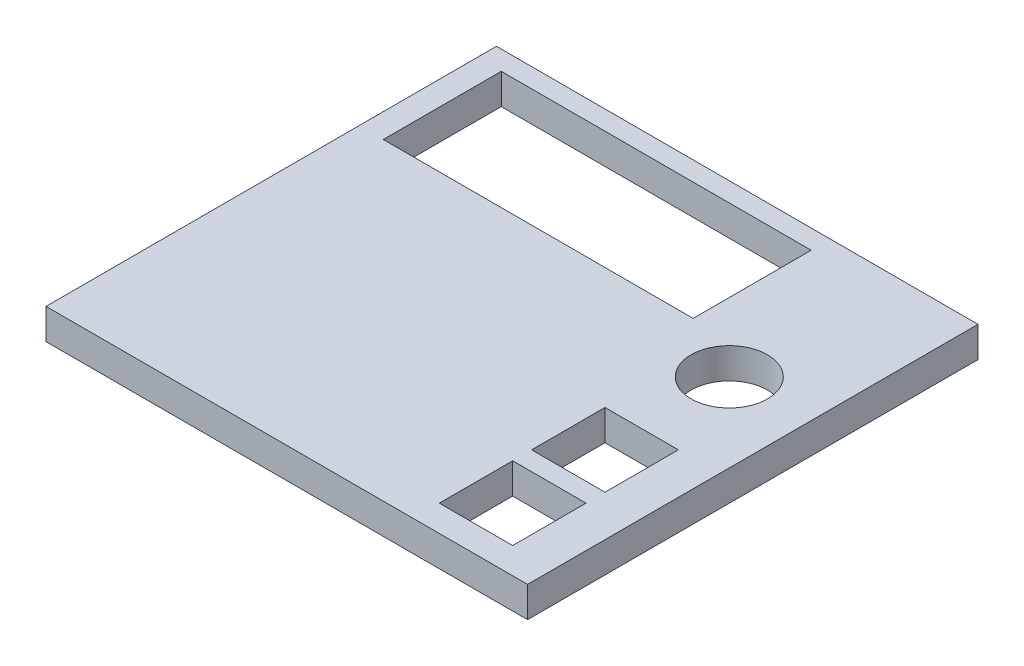
ISO-10303-21;
HEADER;
FILE_DESCRIPTION(('STEP AP214'),'2;1');
FILE_NAME('part.step','',(''),(''),'','','');
FILE_SCHEMA(('AUTOMOTIVE_DESIGN { 1 0 10303 214 1 1 1 1 }'));
ENDSEC;
DATA;
#1=APPLICATION_CONTEXT('core data for automotive mechanical design processes');
#2=APPLICATION_PROTOCOL_DEFINITION('international standard','automotive_design',2000,#1);
#3=PRODUCT_CONTEXT('',#1,'mechanical');
#4=PRODUCT('Part','Part','',(#3));
#5=PRODUCT_RELATED_PRODUCT_CATEGORY('part','',(#4));
#6=PRODUCT_DEFINITION_FORMATION('','',#4);
#7=PRODUCT_DEFINITION_CONTEXT('part definition',#1,'design');
#8=PRODUCT_DEFINITION('design','',#6,#7);
#9=PRODUCT_DEFINITION_SHAPE('','',#8);
#10=(LENGTH_UNIT() NAMED_UNIT(*) SI_UNIT(.MILLI.,.METRE.));
#11=(NAMED_UNIT(*) PLANE_ANGLE_UNIT() SI_UNIT($,.RADIAN.));
#12=(NAMED_UNIT(*) SI_UNIT($,.STERADIAN.) SOLID_ANGLE_UNIT());
#13=UNCERTAINTY_MEASURE_WITH_UNIT(LENGTH_MEASURE(1.E-05),#10,'distance_accuracy_value','');
#14=(GEOMETRIC_REPRESENTATION_CONTEXT(3) GLOBAL_UNCERTAINTY_ASSIGNED_CONTEXT((#13)) GLOBAL_UNIT_ASSIGNED_CONTEXT((#10,
#11,#12)) REPRESENTATION_CONTEXT('',''));
#15=CARTESIAN_POINT('',(0.,0.,0.));
#16=DIRECTION('',(0.,0.,1.));
#17=DIRECTION('',(1.,0.,0.));
#18=AXIS2_PLACEMENT_3D('',#15,#16,#17);
#19=CARTESIAN_POINT('',(0.,5.,0.));
#20=DIRECTION('',(0.,1.,0.));
#21=DIRECTION('',(0.,0.,1.));
#22=AXIS2_PLACEMENT_3D('',#19,#20,#21);
#23=PLANE('',#22);
#24=DIRECTION('',(1.,0.,0.));
#25=VECTOR('',#24,1.);
#26=CARTESIAN_POINT('',(-27.2231495530432,5.,12.911358183839));
#27=LINE('',#26,#25);
#28=CARTESIAN_POINT('',(-27.2231495530432,5.,12.911358183839));
#29=VERTEX_POINT('',#28);
#30=CARTESIAN_POINT('',(23.4468504469568,5.,12.911358183839));
#31=VERTEX_POINT('',#30);
#32=EDGE_CURVE('E255',#29,#31,#27,.T.);
#33=ORIENTED_EDGE('',*,*,#32,.F.);
#34=DIRECTION('',(0.,0.,1.));
#35=VECTOR('',#34,1.);
#36=CARTESIAN_POINT('',(-27.2231495530432,5.,-6.38864181616104));
#37=LINE('',#36,#35);
#38=CARTESIAN_POINT('',(-27.2231495530432,5.,-6.38864181616104));
#39=VERTEX_POINT('',#38);
#40=EDGE_CURVE('E252',#39,#29,#37,.T.);
#41=ORIENTED_EDGE('',*,*,#40,.F.);
#42=DIRECTION('',(-1.,0.,0.));
#43=VECTOR('',#42,1.);
#44=CARTESIAN_POINT('',(-27.2231495530432,5.,-6.38864181616104));
#45=LINE('',#44,#43);
#46=CARTESIAN_POINT('',(23.4468504469568,5.,-6.38864181616104));
#47=VERTEX_POINT('',#46);
#48=EDGE_CURVE('E263',#47,#39,#45,.T.);
#49=ORIENTED_EDGE('',*,*,#48,.F.);
#50=DIRECTION('',(0.,0.,-1.));
#51=VECTOR('',#50,1.);
#52=CARTESIAN_POINT('',(23.4468504469568,5.,-6.38864181616104));
#53=LINE('',#52,#51);
#54=EDGE_CURVE('E259',#31,#47,#53,.T.);
#55=ORIENTED_EDGE('',*,*,#54,.F.);
#56=EDGE_LOOP('',(#33,#41,#49,#55));
#57=FACE_BOUND('',#56,.T.);
#58=DIRECTION('',(0.,0.,1.));
#59=VECTOR('',#58,1.);
#60=CARTESIAN_POINT('',(-31.1631495530432,5.,-9.53864181616104));
#61=LINE('',#60,#59);
#62=CARTESIAN_POINT('',(-31.1631495530432,5.,-9.53864181616104));
#63=VERTEX_POINT('',#62);
#64=CARTESIAN_POINT('',(-31.1631495530432,5.,64.121358183839));
#65=VERTEX_POINT('',#64);
#66=EDGE_CURVE('E295',#63,#65,#61,.T.);
#67=ORIENTED_EDGE('',*,*,#66,.T.);
#68=DIRECTION('',(1.,0.,0.));
#69=VECTOR('',#68,1.);
#70=CARTESIAN_POINT('',(-31.1631495530432,5.,64.121358183839));
#71=LINE('',#70,#69);
#72=CARTESIAN_POINT('',(47.5768504469568,5.,64.121358183839));
#73=VERTEX_POINT('',#72);
#74=EDGE_CURVE('E299',#65,#73,#71,.T.);
#75=ORIENTED_EDGE('',*,*,#74,.T.);
#76=DIRECTION('',(0.,0.,-1.));
#77=VECTOR('',#76,1.);
#78=CARTESIAN_POINT('',(47.5768504469568,5.,-9.53864181616104));
#79=LINE('',#78,#77);
#80=CARTESIAN_POINT('',(47.5768504469568,5.,-9.53864181616104));
#81=VERTEX_POINT('',#80);
#82=EDGE_CURVE('E303',#73,#81,#79,.T.);
#83=ORIENTED_EDGE('',*,*,#82,.T.);
#84=DIRECTION('',(-1.,0.,0.));
#85=VECTOR('',#84,1.);
#86=CARTESIAN_POINT('',(-31.1631495530432,5.,-9.53864181616104));
#87=LINE('',#86,#85);
#88=EDGE_CURVE('E306',#81,#63,#87,.T.);
#89=ORIENTED_EDGE('',*,*,#88,.T.);
#90=EDGE_LOOP('',(#67,#75,#83,#89));
#91=FACE_BOUND('',#90,.T.);
#92=CARTESIAN_POINT('',(34.6768504469568,5.,18.233358183839));
#93=DIRECTION('',(0.,1.,0.));
#94=DIRECTION('',(0.,0.,1.));
#95=AXIS2_PLACEMENT_3D('',#92,#93,#94);
#96=CIRCLE('',#95,6.25000000000001);
#97=CARTESIAN_POINT('',(34.6768504469568,5.,24.483358183839));
#98=VERTEX_POINT('',#97);
#99=EDGE_CURVE('E244',#98,#98,#96,.T.);
#100=ORIENTED_EDGE('',*,*,#99,.F.);
#101=EDGE_LOOP('',(#100));
#102=FACE_BOUND('',#101,.T.);
#103=DIRECTION('',(1.,0.,0.));
#104=VECTOR('',#103,1.);
#105=CARTESIAN_POINT('',(28.8578504469568,5.,44.733358183839));
#106=LINE('',#105,#104);
#107=CARTESIAN_POINT('',(28.8578504469568,5.,44.733358183839));
#108=VERTEX_POINT('',#107);
#109=CARTESIAN_POINT('',(40.8578504469568,5.,44.733358183839));
#110=VERTEX_POINT('',#109);
#111=EDGE_CURVE('E204',#108,#110,#106,.T.);
#112=ORIENTED_EDGE('',*,*,#111,.F.);
#113=DIRECTION('',(0.,0.,1.));
#114=VECTOR('',#113,1.);
#115=CARTESIAN_POINT('',(28.8578504469568,5.,32.733358183839));
#116=LINE('',#115,#114);
#117=CARTESIAN_POINT('',(28.8578504469568,5.,32.733358183839));
#118=VERTEX_POINT('',#117);
#119=EDGE_CURVE('E201',#118,#108,#116,.T.);
#120=ORIENTED_EDGE('',*,*,#119,.F.);
#121=DIRECTION('',(-1.,0.,0.));
#122=VECTOR('',#121,1.);
#123=CARTESIAN_POINT('',(28.8578504469568,5.,32.733358183839));
#124=LINE('',#123,#122);
#125=CARTESIAN_POINT('',(40.8578504469568,5.,32.733358183839));
#126=VERTEX_POINT('',#125);
#127=EDGE_CURVE('E212',#126,#118,#124,.T.);
#128=ORIENTED_EDGE('',*,*,#127,.F.);
#129=DIRECTION('',(0.,0.,-1.));
#130=VECTOR('',#129,1.);
#131=CARTESIAN_POINT('',(40.8578504469568,5.,32.733358183839));
#132=LINE('',#131,#130);
#133=EDGE_CURVE('E208',#110,#126,#132,.T.);
#134=ORIENTED_EDGE('',*,*,#133,.F.);
#135=EDGE_LOOP('',(#112,#120,#128,#134));
#136=FACE_BOUND('',#135,.T.);
#137=DIRECTION('',(1.,0.,0.));
#138=VECTOR('',#137,1.);
#139=CARTESIAN_POINT('',(28.8578504469568,5.,59.833358183839));
#140=LINE('',#139,#138);
#141=CARTESIAN_POINT('',(28.8578504469568,5.,59.833358183839));
#142=VERTEX_POINT('',#141);
#143=CARTESIAN_POINT('',(40.8578504469568,5.,59.833358183839));
#144=VERTEX_POINT('',#143);
#145=EDGE_CURVE('E162',#142,#144,#140,.T.);
#146=ORIENTED_EDGE('',*,*,#145,.F.);
#147=DIRECTION('',(0.,0.,1.));
#148=VECTOR('',#147,1.);
#149=CARTESIAN_POINT('',(28.8578504469568,5.,47.833358183839));
#150=LINE('',#149,#148);
#151=CARTESIAN_POINT('',(28.8578504469568,5.,47.833358183839));
#152=VERTEX_POINT('',#151);
#153=EDGE_CURVE('E153',#152,#142,#150,.T.);
#154=ORIENTED_EDGE('',*,*,#153,.F.);
#155=DIRECTION('',(-1.,0.,0.));
#156=VECTOR('',#155,1.);
#157=CARTESIAN_POINT('',(28.8578504469568,5.,47.833358183839));
#158=LINE('',#157,#156);
#159=CARTESIAN_POINT('',(40.8578504469568,5.,47.833358183839));
#160=VERTEX_POINT('',#159);
#161=EDGE_CURVE('E179',#160,#152,#158,.T.);
#162=ORIENTED_EDGE('',*,*,#161,.F.);
#163=DIRECTION('',(0.,0.,-1.));
#164=VECTOR('',#163,1.);
#165=CARTESIAN_POINT('',(40.8578504469568,5.,47.833358183839));
#166=LINE('',#165,#164);
#167=EDGE_CURVE('E175',#144,#160,#166,.T.);
#168=ORIENTED_EDGE('',*,*,#167,.F.);
#169=EDGE_LOOP('',(#146,#154,#162,#168));
#170=FACE_BOUND('',#169,.T.);
#171=ADVANCED_FACE('F39',(#57,#91,#102,#136,#170),#23,.T.);
#172=CARTESIAN_POINT('',(0.,0.,0.));
#173=DIRECTION('',(0.,1.,0.));
#174=DIRECTION('',(0.,0.,1.));
#175=AXIS2_PLACEMENT_3D('',#172,#173,#174);
#176=PLANE('',#175);
#177=DIRECTION('',(0.,0.,1.));
#178=VECTOR('',#177,1.);
#179=CARTESIAN_POINT('',(28.8578504469568,0.,32.733358183839));
#180=LINE('',#179,#178);
#181=CARTESIAN_POINT('',(28.8578504469568,0.,32.733358183839));
#182=VERTEX_POINT('',#181);
#183=CARTESIAN_POINT('',(28.8578504469568,0.,44.733358183839));
#184=VERTEX_POINT('',#183);
#185=EDGE_CURVE('E171',#182,#184,#180,.T.);
#186=ORIENTED_EDGE('',*,*,#185,.T.);
#187=DIRECTION('',(1.,0.,0.));
#188=VECTOR('',#187,1.);
#189=CARTESIAN_POINT('',(28.8578504469568,0.,44.733358183839));
#190=LINE('',#189,#188);
#191=CARTESIAN_POINT('',(40.8578504469568,0.,44.733358183839));
#192=VERTEX_POINT('',#191);
#193=EDGE_CURVE('E219',#184,#192,#190,.T.);
#194=ORIENTED_EDGE('',*,*,#193,.T.);
#195=DIRECTION('',(0.,0.,-1.));
#196=VECTOR('',#195,1.);
#197=CARTESIAN_POINT('',(40.8578504469568,0.,32.733358183839));
#198=LINE('',#197,#196);
#199=CARTESIAN_POINT('',(40.8578504469568,0.,32.733358183839));
#200=VERTEX_POINT('',#199);
#201=EDGE_CURVE('E223',#192,#200,#198,.T.);
#202=ORIENTED_EDGE('',*,*,#201,.T.);
#203=DIRECTION('',(-1.,0.,0.));
#204=VECTOR('',#203,1.);
#205=CARTESIAN_POINT('',(28.8578504469568,0.,32.733358183839));
#206=LINE('',#205,#204);
#207=EDGE_CURVE('E205',#200,#182,#206,.T.);
#208=ORIENTED_EDGE('',*,*,#207,.T.);
#209=EDGE_LOOP('',(#186,#194,#202,#208));
#210=FACE_BOUND('',#209,.T.);
#211=DIRECTION('',(0.,0.,1.));
#212=VECTOR('',#211,1.);
#213=CARTESIAN_POINT('',(-31.1631495530432,0.,-9.53864181616104));
#214=LINE('',#213,#212);
#215=CARTESIAN_POINT('',(-31.1631495530432,0.,-9.53864181616104));
#216=VERTEX_POINT('',#215);
#217=CARTESIAN_POINT('',(-31.1631495530432,0.,64.121358183839));
#218=VERTEX_POINT('',#217);
#219=EDGE_CURVE('E294',#216,#218,#214,.T.);
#220=ORIENTED_EDGE('',*,*,#219,.F.);
#221=DIRECTION('',(-1.,0.,0.));
#222=VECTOR('',#221,1.);
#223=CARTESIAN_POINT('',(-31.1631495530432,0.,-9.53864181616104));
#224=LINE('',#223,#222);
#225=CARTESIAN_POINT('',(47.5768504469568,0.,-9.53864181616104));
#226=VERTEX_POINT('',#225);
#227=EDGE_CURVE('E300',#226,#216,#224,.T.);
#228=ORIENTED_EDGE('',*,*,#227,.F.);
#229=DIRECTION('',(0.,0.,-1.));
#230=VECTOR('',#229,1.);
#231=CARTESIAN_POINT('',(47.5768504469568,0.,-9.53864181616104));
#232=LINE('',#231,#230);
#233=CARTESIAN_POINT('',(47.5768504469568,0.,64.121358183839));
#234=VERTEX_POINT('',#233);
#235=EDGE_CURVE('E316',#234,#226,#232,.T.);
#236=ORIENTED_EDGE('',*,*,#235,.F.);
#237=DIRECTION('',(1.,0.,0.));
#238=VECTOR('',#237,1.);
#239=CARTESIAN_POINT('',(-31.1631495530432,0.,64.121358183839));
#240=LINE('',#239,#238);
#241=EDGE_CURVE('E313',#218,#234,#240,.T.);
#242=ORIENTED_EDGE('',*,*,#241,.F.);
#243=EDGE_LOOP('',(#220,#228,#236,#242));
#244=FACE_BOUND('',#243,.T.);
#245=DIRECTION('',(0.,0.,1.));
#246=VECTOR('',#245,1.);
#247=CARTESIAN_POINT('',(-27.2231495530432,0.,-6.38864181616104));
#248=LINE('',#247,#246);
#249=CARTESIAN_POINT('',(-27.2231495530432,0.,-6.38864181616104));
#250=VERTEX_POINT('',#249);
#251=CARTESIAN_POINT('',(-27.2231495530432,0.,12.911358183839));
#252=VERTEX_POINT('',#251);
#253=EDGE_CURVE('E248',#250,#252,#248,.T.);
#254=ORIENTED_EDGE('',*,*,#253,.T.);
#255=DIRECTION('',(1.,0.,0.));
#256=VECTOR('',#255,1.);
#257=CARTESIAN_POINT('',(-27.2231495530432,0.,12.911358183839));
#258=LINE('',#257,#256);
#259=CARTESIAN_POINT('',(23.4468504469568,0.,12.911358183839));
#260=VERTEX_POINT('',#259);
#261=EDGE_CURVE('E270',#252,#260,#258,.T.);
#262=ORIENTED_EDGE('',*,*,#261,.T.);
#263=DIRECTION('',(0.,0.,-1.));
#264=VECTOR('',#263,1.);
#265=CARTESIAN_POINT('',(23.4468504469568,0.,-6.38864181616104));
#266=LINE('',#265,#264);
#267=CARTESIAN_POINT('',(23.4468504469568,0.,-6.38864181616104));
#268=VERTEX_POINT('',#267);
#269=EDGE_CURVE('E274',#260,#268,#266,.T.);
#270=ORIENTED_EDGE('',*,*,#269,.T.);
#271=DIRECTION('',(-1.,0.,0.));
#272=VECTOR('',#271,1.);
#273=CARTESIAN_POINT('',(-27.2231495530432,0.,-6.38864181616104));
#274=LINE('',#273,#272);
#275=EDGE_CURVE('E256',#268,#250,#274,.T.);
#276=ORIENTED_EDGE('',*,*,#275,.T.);
#277=EDGE_LOOP('',(#254,#262,#270,#276));
#278=FACE_BOUND('',#277,.T.);
#279=CARTESIAN_POINT('',(34.6768504469568,0.,18.233358183839));
#280=DIRECTION('',(0.,1.,0.));
#281=DIRECTION('',(0.,0.,1.));
#282=AXIS2_PLACEMENT_3D('',#279,#280,#281);
#283=CIRCLE('',#282,6.25000000000001);
#284=CARTESIAN_POINT('',(34.6768504469568,0.,24.483358183839));
#285=VERTEX_POINT('',#284);
#286=EDGE_CURVE('E243',#285,#285,#283,.T.);
#287=ORIENTED_EDGE('',*,*,#286,.T.);
#288=EDGE_LOOP('',(#287));
#289=FACE_BOUND('',#288,.T.);
#290=DIRECTION('',(0.,0.,1.));
#291=VECTOR('',#290,1.);
#292=CARTESIAN_POINT('',(28.8578504469568,0.,47.833358183839));
#293=LINE('',#292,#291);
#294=CARTESIAN_POINT('',(28.8578504469568,0.,47.833358183839));
#295=VERTEX_POINT('',#294);
#296=CARTESIAN_POINT('',(28.8578504469568,0.,59.833358183839));
#297=VERTEX_POINT('',#296);
#298=EDGE_CURVE('E63',#295,#297,#293,.T.);
#299=ORIENTED_EDGE('',*,*,#298,.T.);
#300=DIRECTION('',(1.,0.,0.));
#301=VECTOR('',#300,1.);
#302=CARTESIAN_POINT('',(28.8578504469568,0.,59.833358183839));
#303=LINE('',#302,#301);
#304=CARTESIAN_POINT('',(40.8578504469568,0.,59.833358183839));
#305=VERTEX_POINT('',#304);
#306=EDGE_CURVE('E169',#297,#305,#303,.T.);
#307=ORIENTED_EDGE('',*,*,#306,.T.);
#308=DIRECTION('',(0.,0.,-1.));
#309=VECTOR('',#308,1.);
#310=CARTESIAN_POINT('',(40.8578504469568,0.,47.833358183839));
#311=LINE('',#310,#309);
#312=CARTESIAN_POINT('',(40.8578504469568,0.,47.833358183839));
#313=VERTEX_POINT('',#312);
#314=EDGE_CURVE('E188',#305,#313,#311,.T.);
#315=ORIENTED_EDGE('',*,*,#314,.T.);
#316=DIRECTION('',(-1.,0.,0.));
#317=VECTOR('',#316,1.);
#318=CARTESIAN_POINT('',(28.8578504469568,0.,47.833358183839));
#319=LINE('',#318,#317);
#320=EDGE_CURVE('E163',#313,#295,#319,.T.);
#321=ORIENTED_EDGE('',*,*,#320,.T.);
#322=EDGE_LOOP('',(#299,#307,#315,#321));
#323=FACE_BOUND('',#322,.T.);
#324=ADVANCED_FACE('F339',(#210,#244,#278,#289,#323),#176,.F.);
#325=CARTESIAN_POINT('',(-31.1631495530432,5.,-9.53864181616104));
#326=DIRECTION('',(1.,0.,0.));
#327=DIRECTION('',(0.,0.,-1.));
#328=AXIS2_PLACEMENT_3D('',#325,#326,#327);
#329=PLANE('',#328);
#330=ORIENTED_EDGE('',*,*,#219,.T.);
#331=DIRECTION('',(0.,-1.,0.));
#332=VECTOR('',#331,1.);
#333=CARTESIAN_POINT('',(-31.1631495530432,5.,64.121358183839));
#334=LINE('',#333,#332);
#335=EDGE_CURVE('E11',#65,#218,#334,.T.);
#336=ORIENTED_EDGE('',*,*,#335,.F.);
#337=ORIENTED_EDGE('',*,*,#66,.F.);
#338=DIRECTION('',(0.,-1.,0.));
#339=VECTOR('',#338,1.);
#340=CARTESIAN_POINT('',(-31.1631495530432,5.,-9.53864181616104));
#341=LINE('',#340,#339);
#342=EDGE_CURVE('E309',#63,#216,#341,.T.);
#343=ORIENTED_EDGE('',*,*,#342,.T.);
#344=EDGE_LOOP('',(#330,#336,#337,#343));
#345=FACE_BOUND('',#344,.T.);
#346=ADVANCED_FACE('F41',(#345),#329,.F.);
#347=CARTESIAN_POINT('',(-31.1631495530432,5.,64.121358183839));
#348=DIRECTION('',(0.,0.,-1.));
#349=DIRECTION('',(-1.,0.,0.));
#350=AXIS2_PLACEMENT_3D('',#347,#348,#349);
#351=PLANE('',#350);
#352=ORIENTED_EDGE('',*,*,#241,.T.);
#353=DIRECTION('',(0.,-1.,0.));
#354=VECTOR('',#353,1.);
#355=CARTESIAN_POINT('',(47.5768504469568,5.,64.121358183839));
#356=LINE('',#355,#354);
#357=EDGE_CURVE('E48',#73,#234,#356,.T.);
#358=ORIENTED_EDGE('',*,*,#357,.F.);
#359=ORIENTED_EDGE('',*,*,#74,.F.);
#360=ORIENTED_EDGE('',*,*,#335,.T.);
#361=EDGE_LOOP('',(#352,#358,#359,#360));
#362=FACE_BOUND('',#361,.T.);
#363=ADVANCED_FACE('F350',(#362),#351,.F.);
#364=CARTESIAN_POINT('',(47.5768504469568,5.,-9.53864181616104));
#365=DIRECTION('',(-1.,0.,0.));
#366=DIRECTION('',(0.,0.,1.));
#367=AXIS2_PLACEMENT_3D('',#364,#365,#366);
#368=PLANE('',#367);
#369=ORIENTED_EDGE('',*,*,#235,.T.);
#370=DIRECTION('',(0.,-1.,0.));
#371=VECTOR('',#370,1.);
#372=CARTESIAN_POINT('',(47.5768504469568,5.,-9.53864181616104));
#373=LINE('',#372,#371);
#374=EDGE_CURVE('E324',#81,#226,#373,.T.);
#375=ORIENTED_EDGE('',*,*,#374,.F.);
#376=ORIENTED_EDGE('',*,*,#82,.F.);
#377=ORIENTED_EDGE('',*,*,#357,.T.);
#378=EDGE_LOOP('',(#369,#375,#376,#377));
#379=FACE_BOUND('',#378,.T.);
#380=ADVANCED_FACE('F333',(#379),#368,.F.);
#381=CARTESIAN_POINT('',(-31.1631495530432,5.,-9.53864181616104));
#382=DIRECTION('',(0.,0.,1.));
#383=DIRECTION('',(1.,0.,0.));
#384=AXIS2_PLACEMENT_3D('',#381,#382,#383);
#385=PLANE('',#384);
#386=ORIENTED_EDGE('',*,*,#227,.T.);
#387=ORIENTED_EDGE('',*,*,#342,.F.);
#388=ORIENTED_EDGE('',*,*,#88,.F.);
#389=ORIENTED_EDGE('',*,*,#374,.T.);
#390=EDGE_LOOP('',(#386,#387,#388,#389));
#391=FACE_BOUND('',#390,.T.);
#392=ADVANCED_FACE('F343',(#391),#385,.F.);
#393=CARTESIAN_POINT('',(-27.2231495530432,5.,-6.38864181616104));
#394=DIRECTION('',(1.,0.,0.));
#395=DIRECTION('',(0.,0.,-1.));
#396=AXIS2_PLACEMENT_3D('',#393,#394,#395);
#397=PLANE('',#396);
#398=ORIENTED_EDGE('',*,*,#253,.F.);
#399=DIRECTION('',(0.,-1.,0.));
#400=VECTOR('',#399,1.);
#401=CARTESIAN_POINT('',(-27.2231495530432,5.,-6.38864181616104));
#402=LINE('',#401,#400);
#403=EDGE_CURVE('E266',#39,#250,#402,.T.);
#404=ORIENTED_EDGE('',*,*,#403,.F.);
#405=ORIENTED_EDGE('',*,*,#40,.T.);
#406=DIRECTION('',(0.,-1.,0.));
#407=VECTOR('',#406,1.);
#408=CARTESIAN_POINT('',(-27.2231495530432,5.,12.911358183839));
#409=LINE('',#408,#407);
#410=EDGE_CURVE('E290',#29,#252,#409,.T.);
#411=ORIENTED_EDGE('',*,*,#410,.T.);
#412=EDGE_LOOP('',(#398,#404,#405,#411));
#413=FACE_BOUND('',#412,.T.);
#414=ADVANCED_FACE('F367',(#413),#397,.T.);
#415=CARTESIAN_POINT('',(-27.2231495530432,5.,12.911358183839));
#416=DIRECTION('',(0.,0.,-1.));
#417=DIRECTION('',(-1.,0.,0.));
#418=AXIS2_PLACEMENT_3D('',#415,#416,#417);
#419=PLANE('',#418);
#420=ORIENTED_EDGE('',*,*,#261,.F.);
#421=ORIENTED_EDGE('',*,*,#410,.F.);
#422=ORIENTED_EDGE('',*,*,#32,.T.);
#423=DIRECTION('',(0.,-1.,0.));
#424=VECTOR('',#423,1.);
#425=CARTESIAN_POINT('',(23.4468504469568,5.,12.911358183839));
#426=LINE('',#425,#424);
#427=EDGE_CURVE('E287',#31,#260,#426,.T.);
#428=ORIENTED_EDGE('',*,*,#427,.T.);
#429=EDGE_LOOP('',(#420,#421,#422,#428));
#430=FACE_BOUND('',#429,.T.);
#431=ADVANCED_FACE('F374',(#430),#419,.T.);
#432=CARTESIAN_POINT('',(23.4468504469568,5.,-6.38864181616104));
#433=DIRECTION('',(-1.,0.,0.));
#434=DIRECTION('',(0.,0.,1.));
#435=AXIS2_PLACEMENT_3D('',#432,#433,#434);
#436=PLANE('',#435);
#437=ORIENTED_EDGE('',*,*,#269,.F.);
#438=ORIENTED_EDGE('',*,*,#427,.F.);
#439=ORIENTED_EDGE('',*,*,#54,.T.);
#440=DIRECTION('',(0.,-1.,0.));
#441=VECTOR('',#440,1.);
#442=CARTESIAN_POINT('',(23.4468504469568,5.,-6.38864181616104));
#443=LINE('',#442,#441);
#444=EDGE_CURVE('E284',#47,#268,#443,.T.);
#445=ORIENTED_EDGE('',*,*,#444,.T.);
#446=EDGE_LOOP('',(#437,#438,#439,#445));
#447=FACE_BOUND('',#446,.T.);
#448=ADVANCED_FACE('F379',(#447),#436,.T.);
#449=CARTESIAN_POINT('',(-27.2231495530432,5.,-6.38864181616104));
#450=DIRECTION('',(0.,0.,1.));
#451=DIRECTION('',(1.,0.,0.));
#452=AXIS2_PLACEMENT_3D('',#449,#450,#451);
#453=PLANE('',#452);
#454=ORIENTED_EDGE('',*,*,#275,.F.);
#455=ORIENTED_EDGE('',*,*,#444,.F.);
#456=ORIENTED_EDGE('',*,*,#48,.T.);
#457=ORIENTED_EDGE('',*,*,#403,.T.);
#458=EDGE_LOOP('',(#454,#455,#456,#457));
#459=FACE_BOUND('',#458,.T.);
#460=ADVANCED_FACE('F386',(#459),#453,.T.);
#461=CARTESIAN_POINT('',(34.6768504469568,5.,18.233358183839));
#462=DIRECTION('',(0.,-1.,0.));
#463=DIRECTION('',(0.,0.,-1.));
#464=AXIS2_PLACEMENT_3D('',#461,#462,#463);
#465=CYLINDRICAL_SURFACE('',#464,6.25000000000001);
#466=ORIENTED_EDGE('',*,*,#99,.T.);
#467=EDGE_LOOP('',(#466));
#468=FACE_BOUND('',#467,.T.);
#469=ORIENTED_EDGE('',*,*,#286,.F.);
#470=EDGE_LOOP('',(#469));
#471=FACE_BOUND('',#470,.T.);
#472=ADVANCED_FACE('F398',(#468,#471),#465,.F.);
#473=CARTESIAN_POINT('',(28.8578504469568,5.,32.733358183839));
#474=DIRECTION('',(1.,0.,0.));
#475=DIRECTION('',(0.,0.,-1.));
#476=AXIS2_PLACEMENT_3D('',#473,#474,#475);
#477=PLANE('',#476);
#478=ORIENTED_EDGE('',*,*,#185,.F.);
#479=DIRECTION('',(0.,-1.,0.));
#480=VECTOR('',#479,1.);
#481=CARTESIAN_POINT('',(28.8578504469568,5.,32.733358183839));
#482=LINE('',#481,#480);
#483=EDGE_CURVE('E215',#118,#182,#482,.T.);
#484=ORIENTED_EDGE('',*,*,#483,.F.);
#485=ORIENTED_EDGE('',*,*,#119,.T.);
#486=DIRECTION('',(0.,-1.,0.));
#487=VECTOR('',#486,1.);
#488=CARTESIAN_POINT('',(28.8578504469568,5.,44.733358183839));
#489=LINE('',#488,#487);
#490=EDGE_CURVE('E239',#108,#184,#489,.T.);
#491=ORIENTED_EDGE('',*,*,#490,.T.);
#492=EDGE_LOOP('',(#478,#484,#485,#491));
#493=FACE_BOUND('',#492,.T.);
#494=ADVANCED_FACE('F403',(#493),#477,.T.);
#495=CARTESIAN_POINT('',(28.8578504469568,5.,44.733358183839));
#496=DIRECTION('',(0.,0.,-1.));
#497=DIRECTION('',(-1.,0.,0.));
#498=AXIS2_PLACEMENT_3D('',#495,#496,#497);
#499=PLANE('',#498);
#500=ORIENTED_EDGE('',*,*,#193,.F.);
#501=ORIENTED_EDGE('',*,*,#490,.F.);
#502=ORIENTED_EDGE('',*,*,#111,.T.);
#503=DIRECTION('',(0.,-1.,0.));
#504=VECTOR('',#503,1.);
#505=CARTESIAN_POINT('',(40.8578504469568,5.,44.733358183839));
#506=LINE('',#505,#504);
#507=EDGE_CURVE('E236',#110,#192,#506,.T.);
#508=ORIENTED_EDGE('',*,*,#507,.T.);
#509=EDGE_LOOP('',(#500,#501,#502,#508));
#510=FACE_BOUND('',#509,.T.);
#511=ADVANCED_FACE('F407',(#510),#499,.T.);
#512=CARTESIAN_POINT('',(40.8578504469568,5.,32.733358183839));
#513=DIRECTION('',(-1.,0.,0.));
#514=DIRECTION('',(0.,0.,1.));
#515=AXIS2_PLACEMENT_3D('',#512,#513,#514);
#516=PLANE('',#515);
#517=ORIENTED_EDGE('',*,*,#201,.F.);
#518=ORIENTED_EDGE('',*,*,#507,.F.);
#519=ORIENTED_EDGE('',*,*,#133,.T.);
#520=DIRECTION('',(0.,-1.,0.));
#521=VECTOR('',#520,1.);
#522=CARTESIAN_POINT('',(40.8578504469568,5.,32.733358183839));
#523=LINE('',#522,#521);
#524=EDGE_CURVE('E233',#126,#200,#523,.T.);
#525=ORIENTED_EDGE('',*,*,#524,.T.);
#526=EDGE_LOOP('',(#517,#518,#519,#525));
#527=FACE_BOUND('',#526,.T.);
#528=ADVANCED_FACE('F411',(#527),#516,.T.);
#529=CARTESIAN_POINT('',(28.8578504469568,5.,32.733358183839));
#530=DIRECTION('',(0.,0.,1.));
#531=DIRECTION('',(1.,0.,0.));
#532=AXIS2_PLACEMENT_3D('',#529,#530,#531);
#533=PLANE('',#532);
#534=ORIENTED_EDGE('',*,*,#207,.F.);
#535=ORIENTED_EDGE('',*,*,#524,.F.);
#536=ORIENTED_EDGE('',*,*,#127,.T.);
#537=ORIENTED_EDGE('',*,*,#483,.T.);
#538=EDGE_LOOP('',(#534,#535,#536,#537));
#539=FACE_BOUND('',#538,.T.);
#540=ADVANCED_FACE('F415',(#539),#533,.T.);
#541=CARTESIAN_POINT('',(28.8578504469568,5.,47.833358183839));
#542=DIRECTION('',(1.,0.,0.));
#543=DIRECTION('',(0.,0.,-1.));
#544=AXIS2_PLACEMENT_3D('',#541,#542,#543);
#545=PLANE('',#544);
#546=ORIENTED_EDGE('',*,*,#298,.F.);
#547=DIRECTION('',(0.,-1.,0.));
#548=VECTOR('',#547,1.);
#549=CARTESIAN_POINT('',(28.8578504469568,5.,47.833358183839));
#550=LINE('',#549,#548);
#551=EDGE_CURVE('E157',#152,#295,#550,.T.);
#552=ORIENTED_EDGE('',*,*,#551,.F.);
#553=ORIENTED_EDGE('',*,*,#153,.T.);
#554=DIRECTION('',(0.,-1.,0.));
#555=VECTOR('',#554,1.);
#556=CARTESIAN_POINT('',(28.8578504469568,5.,59.833358183839));
#557=LINE('',#556,#555);
#558=EDGE_CURVE('E156',#142,#297,#557,.T.);
#559=ORIENTED_EDGE('',*,*,#558,.T.);
#560=EDGE_LOOP('',(#546,#552,#553,#559));
#561=FACE_BOUND('',#560,.T.);
#562=ADVANCED_FACE('F155',(#561),#545,.T.);
#563=CARTESIAN_POINT('',(28.8578504469568,5.,59.833358183839));
#564=DIRECTION('',(0.,0.,-1.));
#565=DIRECTION('',(-1.,0.,0.));
#566=AXIS2_PLACEMENT_3D('',#563,#564,#565);
#567=PLANE('',#566);
#568=ORIENTED_EDGE('',*,*,#306,.F.);
#569=ORIENTED_EDGE('',*,*,#558,.F.);
#570=ORIENTED_EDGE('',*,*,#145,.T.);
#571=DIRECTION('',(0.,-1.,0.));
#572=VECTOR('',#571,1.);
#573=CARTESIAN_POINT('',(40.8578504469568,5.,59.833358183839));
#574=LINE('',#573,#572);
#575=EDGE_CURVE('E172',#144,#305,#574,.T.);
#576=ORIENTED_EDGE('',*,*,#575,.T.);
#577=EDGE_LOOP('',(#568,#569,#570,#576));
#578=FACE_BOUND('',#577,.T.);
#579=ADVANCED_FACE('F166',(#578),#567,.T.);
#580=CARTESIAN_POINT('',(40.8578504469568,5.,47.833358183839));
#581=DIRECTION('',(-1.,0.,0.));
#582=DIRECTION('',(0.,0.,1.));
#583=AXIS2_PLACEMENT_3D('',#580,#581,#582);
#584=PLANE('',#583);
#585=ORIENTED_EDGE('',*,*,#314,.F.);
#586=ORIENTED_EDGE('',*,*,#575,.F.);
#587=ORIENTED_EDGE('',*,*,#167,.T.);
#588=DIRECTION('',(0.,-1.,0.));
#589=VECTOR('',#588,1.);
#590=CARTESIAN_POINT('',(40.8578504469568,5.,47.833358183839));
#591=LINE('',#590,#589);
#592=EDGE_CURVE('E55',#160,#313,#591,.T.);
#593=ORIENTED_EDGE('',*,*,#592,.T.);
#594=EDGE_LOOP('',(#585,#586,#587,#593));
#595=FACE_BOUND('',#594,.T.);
#596=ADVANCED_FACE('F424',(#595),#584,.T.);
#597=CARTESIAN_POINT('',(28.8578504469568,5.,47.833358183839));
#598=DIRECTION('',(0.,0.,1.));
#599=DIRECTION('',(1.,0.,0.));
#600=AXIS2_PLACEMENT_3D('',#597,#598,#599);
#601=PLANE('',#600);
#602=ORIENTED_EDGE('',*,*,#320,.F.);
#603=ORIENTED_EDGE('',*,*,#592,.F.);
#604=ORIENTED_EDGE('',*,*,#161,.T.);
#605=ORIENTED_EDGE('',*,*,#551,.T.);
#606=EDGE_LOOP('',(#602,#603,#604,#605));
#607=FACE_BOUND('',#606,.T.);
#608=ADVANCED_FACE('F427',(#607),#601,.T.);
#609=CLOSED_SHELL('',(#171,#324,#346,#363,#380,#392,#414,#431,#448,#460,#472,#494,#511,#528,
#540,#562,#579,#596,#608));
#610=MANIFOLD_SOLID_BREP('B2',#609);
#611=ADVANCED_BREP_SHAPE_REPRESENTATION('',(#18,#610),#14);
#612=SHAPE_DEFINITION_REPRESENTATION(#9,#611);
ENDSEC;
END-ISO-10303-21;
